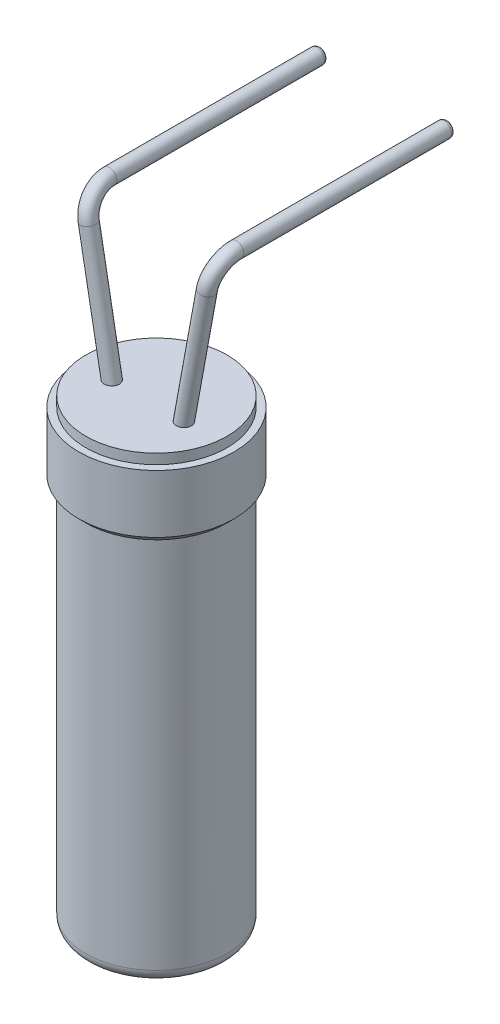
ISO-10303-21;
HEADER;
FILE_DESCRIPTION(('STEP AP214'),'2;1');
FILE_NAME('part.step','',(''),(''),'','','');
FILE_SCHEMA(('AUTOMOTIVE_DESIGN { 1 0 10303 214 1 1 1 1 }'));
ENDSEC;
DATA;
#1=APPLICATION_CONTEXT('core data for automotive mechanical design processes');
#2=APPLICATION_PROTOCOL_DEFINITION('international standard','automotive_design',2000,#1);
#3=PRODUCT_CONTEXT('',#1,'mechanical');
#4=PRODUCT('Part','Part','',(#3));
#5=PRODUCT_RELATED_PRODUCT_CATEGORY('part','',(#4));
#6=PRODUCT_DEFINITION_FORMATION('','',#4);
#7=PRODUCT_DEFINITION_CONTEXT('part definition',#1,'design');
#8=PRODUCT_DEFINITION('design','',#6,#7);
#9=PRODUCT_DEFINITION_SHAPE('','',#8);
#10=(LENGTH_UNIT() NAMED_UNIT(*) SI_UNIT(.MILLI.,.METRE.));
#11=(NAMED_UNIT(*) PLANE_ANGLE_UNIT() SI_UNIT($,.RADIAN.));
#12=(NAMED_UNIT(*) SI_UNIT($,.STERADIAN.) SOLID_ANGLE_UNIT());
#13=UNCERTAINTY_MEASURE_WITH_UNIT(LENGTH_MEASURE(1.E-05),#10,'distance_accuracy_value','');
#14=(GEOMETRIC_REPRESENTATION_CONTEXT(3) GLOBAL_UNCERTAINTY_ASSIGNED_CONTEXT((#13)) GLOBAL_UNIT_ASSIGNED_CONTEXT((#10,
#11,#12)) REPRESENTATION_CONTEXT('',''));
#15=CARTESIAN_POINT('',(0.,0.,0.));
#16=DIRECTION('',(0.,0.,1.));
#17=DIRECTION('',(1.,0.,0.));
#18=AXIS2_PLACEMENT_3D('',#15,#16,#17);
#19=CARTESIAN_POINT('',(1.27,-12.2,1.55));
#20=DIRECTION('',(0.,-1.,0.));
#21=DIRECTION('',(-1.,0.,0.));
#22=AXIS2_PLACEMENT_3D('',#19,#20,#21);
#23=PLANE('',#22);
#24=CARTESIAN_POINT('',(1.27,-12.2,1.55));
#25=DIRECTION('',(0.,-1.,0.));
#26=DIRECTION('',(0.,0.,-1.));
#27=AXIS2_PLACEMENT_3D('',#24,#25,#26);
#28=CIRCLE('',#27,1.159090909091);
#29=CARTESIAN_POINT('',(1.27,-12.2,0.390909090909));
#30=VERTEX_POINT('',#29);
#31=EDGE_CURVE('E10',#30,#30,#28,.T.);
#32=ORIENTED_EDGE('',*,*,#31,.T.);
#33=EDGE_LOOP('',(#32));
#34=FACE_BOUND('',#33,.T.);
#35=ADVANCED_FACE('F15',(#34),#23,.T.);
#36=CARTESIAN_POINT('',(1.27,-11.95,1.55));
#37=DIRECTION('',(0.,-1.,0.));
#38=DIRECTION('',(0.,0.,-1.));
#39=AXIS2_PLACEMENT_3D('',#36,#37,#38);
#40=TOROIDAL_SURFACE('',#39,1.159090909091,0.25);
#41=ORIENTED_EDGE('',*,*,#31,.F.);
#42=EDGE_LOOP('',(#41));
#43=FACE_BOUND('',#42,.T.);
#44=CARTESIAN_POINT('',(1.27,-11.95,1.55));
#45=DIRECTION('',(0.,-1.,0.));
#46=DIRECTION('',(0.,0.,-1.));
#47=AXIS2_PLACEMENT_3D('',#44,#45,#46);
#48=CIRCLE('',#47,1.409090909091);
#49=CARTESIAN_POINT('',(1.27,-11.95,0.140909090909));
#50=VERTEX_POINT('',#49);
#51=EDGE_CURVE('E22',#50,#50,#48,.T.);
#52=ORIENTED_EDGE('',*,*,#51,.T.);
#53=EDGE_LOOP('',(#52));
#54=FACE_BOUND('',#53,.T.);
#55=ADVANCED_FACE('F117',(#43,#54),#40,.T.);
#56=CARTESIAN_POINT('',(2.54,0.,-3.));
#57=DIRECTION('',(0.,0.,1.));
#58=DIRECTION('',(1.,0.,0.));
#59=AXIS2_PLACEMENT_3D('',#56,#57,#58);
#60=PLANE('',#59);
#61=CARTESIAN_POINT('',(2.54,0.,-3.));
#62=DIRECTION('',(0.,0.,1.));
#63=DIRECTION('',(-0.180327868852024,-0.983606557377129,0.));
#64=AXIS2_PLACEMENT_3D('',#61,#62,#63);
#65=CIRCLE('',#64,0.075);
#66=CARTESIAN_POINT('',(2.5264754098361,-0.0737704918032847,-3.));
#67=VERTEX_POINT('',#66);
#68=EDGE_CURVE('E28',#67,#67,#65,.T.);
#69=ORIENTED_EDGE('',*,*,#68,.F.);
#70=EDGE_LOOP('',(#69));
#71=FACE_BOUND('',#70,.T.);
#72=ADVANCED_FACE('F121',(#71),#60,.F.);
#73=CARTESIAN_POINT('',(1.27,-3.2,1.55));
#74=DIRECTION('',(0.,1.,0.));
#75=DIRECTION('',(0.,0.,-1.));
#76=AXIS2_PLACEMENT_3D('',#73,#74,#75);
#77=CYLINDRICAL_SURFACE('',#76,1.409090909091);
#78=ORIENTED_EDGE('',*,*,#51,.F.);
#79=EDGE_LOOP('',(#78));
#80=FACE_BOUND('',#79,.T.);
#81=CARTESIAN_POINT('',(1.27,-4.499659090909,1.55));
#82=DIRECTION('',(0.,1.,0.));
#83=DIRECTION('',(1.,0.,0.));
#84=AXIS2_PLACEMENT_3D('',#81,#82,#83);
#85=CIRCLE('',#84,1.409090909091);
#86=CARTESIAN_POINT('',(2.679090909091,-4.499659090909,1.55));
#87=VERTEX_POINT('',#86);
#88=EDGE_CURVE('E38',#87,#87,#85,.T.);
#89=ORIENTED_EDGE('',*,*,#88,.F.);
#90=EDGE_LOOP('',(#89));
#91=FACE_BOUND('',#90,.T.);
#92=ADVANCED_FACE('F126',(#80,#91),#77,.T.);
#93=CARTESIAN_POINT('',(2.54,0.,-2.925));
#94=DIRECTION('',(0.,0.,-1.));
#95=DIRECTION('',(-0.180327868852024,-0.983606557377129,0.));
#96=AXIS2_PLACEMENT_3D('',#93,#94,#95);
#97=DEGENERATE_TOROIDAL_SURFACE('',#96,0.075,0.075,.T.);
#98=ORIENTED_EDGE('',*,*,#68,.T.);
#99=EDGE_LOOP('',(#98));
#100=FACE_BOUND('',#99,.T.);
#101=CARTESIAN_POINT('',(2.54,0.,-2.925));
#102=DIRECTION('',(0.,0.,1.));
#103=DIRECTION('',(-0.180327868852024,-0.983606557377129,0.));
#104=AXIS2_PLACEMENT_3D('',#101,#102,#103);
#105=CIRCLE('',#104,0.15);
#106=CARTESIAN_POINT('',(2.5129508196722,-0.147540983606569,-2.925));
#107=VERTEX_POINT('',#106);
#108=EDGE_CURVE('E45',#107,#107,#105,.T.);
#109=ORIENTED_EDGE('',*,*,#108,.F.);
#110=EDGE_LOOP('',(#109));
#111=FACE_BOUND('',#110,.T.);
#112=ADVANCED_FACE('F135',(#100,#111),#97,.T.);
#113=CARTESIAN_POINT('',(1.27,-4.35875,1.55));
#114=DIRECTION('',(0.,1.,0.));
#115=DIRECTION('',(0.,0.,-1.));
#116=AXIS2_PLACEMENT_3D('',#113,#114,#115);
#117=CONICAL_SURFACE('',#116,1.55,0.785398163397);
#118=ORIENTED_EDGE('',*,*,#88,.T.);
#119=EDGE_LOOP('',(#118));
#120=FACE_BOUND('',#119,.T.);
#121=CARTESIAN_POINT('',(1.27,-4.35875,1.55));
#122=DIRECTION('',(0.,-1.,0.));
#123=DIRECTION('',(0.,0.,-1.));
#124=AXIS2_PLACEMENT_3D('',#121,#122,#123);
#125=CIRCLE('',#124,1.55);
#126=CARTESIAN_POINT('',(1.27,-4.35875,0.));
#127=VERTEX_POINT('',#126);
#128=EDGE_CURVE('E46',#127,#127,#125,.T.);
#129=ORIENTED_EDGE('',*,*,#128,.T.);
#130=EDGE_LOOP('',(#129));
#131=FACE_BOUND('',#130,.T.);
#132=ADVANCED_FACE('F137',(#120,#131),#117,.T.);
#133=CARTESIAN_POINT('',(2.54,0.,-3.));
#134=DIRECTION('',(0.,0.,1.));
#135=DIRECTION('',(-0.180327868852024,-0.983606557377129,0.));
#136=AXIS2_PLACEMENT_3D('',#133,#134,#135);
#137=CYLINDRICAL_SURFACE('',#136,0.15);
#138=CARTESIAN_POINT('',(2.54,0.,1.222222222222));
#139=DIRECTION('',(0.,0.,1.));
#140=DIRECTION('',(-0.180327868852024,-0.983606557377129,0.));
#141=AXIS2_PLACEMENT_3D('',#138,#139,#140);
#142=CIRCLE('',#141,0.15);
#143=CARTESIAN_POINT('',(2.5670491803277,0.147540983606155,1.222222222222));
#144=VERTEX_POINT('',#143);
#145=EDGE_CURVE('E49',#144,#144,#142,.T.);
#146=ORIENTED_EDGE('',*,*,#145,.F.);
#147=EDGE_LOOP('',(#146));
#148=FACE_BOUND('',#147,.T.);
#149=ORIENTED_EDGE('',*,*,#108,.T.);
#150=EDGE_LOOP('',(#149));
#151=FACE_BOUND('',#150,.T.);
#152=ADVANCED_FACE('F139',(#148,#151),#137,.T.);
#153=CARTESIAN_POINT('',(1.27,-3.2,1.55));
#154=DIRECTION('',(0.,1.,0.));
#155=DIRECTION('',(0.,0.,-1.));
#156=AXIS2_PLACEMENT_3D('',#153,#154,#155);
#157=CYLINDRICAL_SURFACE('',#156,1.55);
#158=ORIENTED_EDGE('',*,*,#128,.F.);
#159=EDGE_LOOP('',(#158));
#160=FACE_BOUND('',#159,.T.);
#161=CARTESIAN_POINT('',(1.27,-3.2,1.55));
#162=DIRECTION('',(0.,-1.,0.));
#163=DIRECTION('',(0.,0.,-1.));
#164=AXIS2_PLACEMENT_3D('',#161,#162,#163);
#165=CIRCLE('',#164,1.55);
#166=CARTESIAN_POINT('',(1.27,-3.2,0.));
#167=VERTEX_POINT('',#166);
#168=EDGE_CURVE('E53',#167,#167,#165,.T.);
#169=ORIENTED_EDGE('',*,*,#168,.T.);
#170=EDGE_LOOP('',(#169));
#171=FACE_BOUND('',#170,.T.);
#172=ADVANCED_FACE('F143',(#160,#171),#157,.T.);
#173=CARTESIAN_POINT('',(2.449836065574,-0.491803278689,1.222222222222));
#174=DIRECTION('',(0.983606557377129,-0.180327868852024,0.));
#175=DIRECTION('',(0.180327868852024,0.983606557377129,0.));
#176=AXIS2_PLACEMENT_3D('',#173,#174,#175);
#177=TOROIDAL_SURFACE('',#176,0.5,0.15);
#178=CARTESIAN_POINT('',(2.449836065574,-0.491803278689,1.722222222222));
#179=DIRECTION('',(0.180327868852024,0.983606557377129,0.));
#180=DIRECTION('',(0.,0.,1.));
#181=AXIS2_PLACEMENT_3D('',#178,#179,#180);
#182=CIRCLE('',#181,0.15);
#183=CARTESIAN_POINT('',(2.449836065574,-0.491803278689,1.872222222222));
#184=VERTEX_POINT('',#183);
#185=EDGE_CURVE('E56',#184,#184,#182,.T.);
#186=CARTESIAN_POINT('',(2.449836065574,-0.491803278689,1.222222222222));
#187=DIRECTION('',(0.983606557377129,-0.180327868852024,0.));
#188=DIRECTION('',(0.180327868852024,0.983606557377129,0.));
#189=AXIS2_PLACEMENT_3D('',#186,#187,#188);
#190=CIRCLE('',#189,0.65);
#191=EDGE_CURVE('',#144,#184,#190,.T.);
#192=ORIENTED_EDGE('',*,*,#145,.T.);
#193=ORIENTED_EDGE('',*,*,#185,.T.);
#194=ORIENTED_EDGE('',*,*,#191,.T.);
#195=ORIENTED_EDGE('',*,*,#191,.F.);
#196=EDGE_LOOP('',(#192,#194,#193,#195));
#197=FACE_BOUND('',#196,.T.);
#198=ADVANCED_FACE('F141',(#197),#177,.T.);
#199=CARTESIAN_POINT('',(1.27,-3.2,1.55));
#200=DIRECTION('',(0.,-1.,0.));
#201=DIRECTION('',(-1.,0.,0.));
#202=AXIS2_PLACEMENT_3D('',#199,#200,#201);
#203=PLANE('',#202);
#204=CARTESIAN_POINT('',(1.27,-3.2,1.55));
#205=DIRECTION('',(0.,1.,0.));
#206=DIRECTION('',(0.,0.,-1.));
#207=AXIS2_PLACEMENT_3D('',#204,#205,#206);
#208=CIRCLE('',#207,1.409090909091);
#209=CARTESIAN_POINT('',(1.27,-3.2,0.140909090909));
#210=VERTEX_POINT('',#209);
#211=EDGE_CURVE('E54',#210,#210,#208,.T.);
#212=ORIENTED_EDGE('',*,*,#211,.F.);
#213=EDGE_LOOP('',(#212));
#214=FACE_BOUND('',#213,.T.);
#215=ORIENTED_EDGE('',*,*,#168,.F.);
#216=EDGE_LOOP('',(#215));
#217=FACE_BOUND('',#216,.T.);
#218=ADVANCED_FACE('F148',(#214,#217),#203,.F.);
#219=CARTESIAN_POINT('',(2.449836065574,-0.491803278689,1.722222222222));
#220=DIRECTION('',(-0.180327868852024,-0.983606557377129,0.));
#221=DIRECTION('',(0.,0.,-1.));
#222=AXIS2_PLACEMENT_3D('',#219,#220,#221);
#223=CYLINDRICAL_SURFACE('',#222,0.15);
#224=CARTESIAN_POINT('',(1.99,-3.,1.722222222222));
#225=DIRECTION('',(0.,-1.,0.));
#226=DIRECTION('',(-1.,0.,0.));
#227=AXIS2_PLACEMENT_3D('',#224,#225,#226);
#228=ELLIPSE('',#227,0.1525,0.15);
#229=CARTESIAN_POINT('',(1.8375,-3.,1.722222222222));
#230=VERTEX_POINT('',#229);
#231=EDGE_CURVE('E58',#230,#230,#228,.T.);
#232=ORIENTED_EDGE('',*,*,#231,.F.);
#233=EDGE_LOOP('',(#232));
#234=FACE_BOUND('',#233,.T.);
#235=ORIENTED_EDGE('',*,*,#185,.F.);
#236=EDGE_LOOP('',(#235));
#237=FACE_BOUND('',#236,.T.);
#238=ADVANCED_FACE('F112',(#234,#237),#223,.T.);
#239=CARTESIAN_POINT('',(1.27,-3.,1.55));
#240=DIRECTION('',(0.,1.,0.));
#241=DIRECTION('',(0.,0.,-1.));
#242=AXIS2_PLACEMENT_3D('',#239,#240,#241);
#243=CYLINDRICAL_SURFACE('',#242,1.409090909091);
#244=ORIENTED_EDGE('',*,*,#211,.T.);
#245=EDGE_LOOP('',(#244));
#246=FACE_BOUND('',#245,.T.);
#247=CARTESIAN_POINT('',(1.27,-3.,1.55));
#248=DIRECTION('',(0.,-1.,0.));
#249=DIRECTION('',(0.,0.,-1.));
#250=AXIS2_PLACEMENT_3D('',#247,#248,#249);
#251=CIRCLE('',#250,1.409090909091);
#252=CARTESIAN_POINT('',(1.27,-3.,0.140909090909));
#253=VERTEX_POINT('',#252);
#254=EDGE_CURVE('E63',#253,#253,#251,.T.);
#255=ORIENTED_EDGE('',*,*,#254,.T.);
#256=EDGE_LOOP('',(#255));
#257=FACE_BOUND('',#256,.T.);
#258=ADVANCED_FACE('F96',(#246,#257),#243,.T.);
#259=CARTESIAN_POINT('',(1.27,-3.,1.55));
#260=DIRECTION('',(0.,-1.,0.));
#261=DIRECTION('',(-1.,0.,0.));
#262=AXIS2_PLACEMENT_3D('',#259,#260,#261);
#263=PLANE('',#262);
#264=ORIENTED_EDGE('',*,*,#231,.T.);
#265=EDGE_LOOP('',(#264));
#266=FACE_BOUND('',#265,.T.);
#267=CARTESIAN_POINT('',(0.55,-3.,1.722222222222));
#268=DIRECTION('',(0.,-1.,0.));
#269=DIRECTION('',(1.,0.,0.));
#270=AXIS2_PLACEMENT_3D('',#267,#268,#269);
#271=ELLIPSE('',#270,0.1525,0.15);
#272=CARTESIAN_POINT('',(0.7025,-3.,1.722222222222));
#273=VERTEX_POINT('',#272);
#274=EDGE_CURVE('E67',#273,#273,#271,.T.);
#275=ORIENTED_EDGE('',*,*,#274,.T.);
#276=EDGE_LOOP('',(#275));
#277=FACE_BOUND('',#276,.T.);
#278=ORIENTED_EDGE('',*,*,#254,.F.);
#279=EDGE_LOOP('',(#278));
#280=FACE_BOUND('',#279,.T.);
#281=ADVANCED_FACE('F98',(#266,#277,#280),#263,.F.);
#282=CARTESIAN_POINT('',(0.09016393442623,-0.491803278689,1.722222222222));
#283=DIRECTION('',(0.180327868852024,-0.983606557377129,0.));
#284=DIRECTION('',(0.,0.,-1.));
#285=AXIS2_PLACEMENT_3D('',#282,#283,#284);
#286=CYLINDRICAL_SURFACE('',#285,0.15);
#287=ORIENTED_EDGE('',*,*,#274,.F.);
#288=EDGE_LOOP('',(#287));
#289=FACE_BOUND('',#288,.T.);
#290=CARTESIAN_POINT('',(0.09016393442623,-0.491803278689,1.722222222222));
#291=DIRECTION('',(-0.180327868852024,0.983606557377129,0.));
#292=DIRECTION('',(0.,0.,1.));
#293=AXIS2_PLACEMENT_3D('',#290,#291,#292);
#294=CIRCLE('',#293,0.15);
#295=CARTESIAN_POINT('',(0.09016393442623,-0.491803278689,1.872222222222));
#296=VERTEX_POINT('',#295);
#297=EDGE_CURVE('E65',#296,#296,#294,.T.);
#298=ORIENTED_EDGE('',*,*,#297,.F.);
#299=EDGE_LOOP('',(#298));
#300=FACE_BOUND('',#299,.T.);
#301=ADVANCED_FACE('F99',(#289,#300),#286,.T.);
#302=CARTESIAN_POINT('',(0.,0.,-3.));
#303=DIRECTION('',(0.,0.,1.));
#304=DIRECTION('',(1.,0.,0.));
#305=AXIS2_PLACEMENT_3D('',#302,#303,#304);
#306=PLANE('',#305);
#307=CARTESIAN_POINT('',(0.,0.,-3.));
#308=DIRECTION('',(0.,0.,1.));
#309=DIRECTION('',(0.180327868852024,-0.983606557377129,0.));
#310=AXIS2_PLACEMENT_3D('',#307,#308,#309);
#311=CIRCLE('',#310,0.075);
#312=CARTESIAN_POINT('',(0.0135245901639018,-0.0737704918032847,-3.));
#313=VERTEX_POINT('',#312);
#314=EDGE_CURVE('E69',#313,#313,#311,.T.);
#315=ORIENTED_EDGE('',*,*,#314,.F.);
#316=EDGE_LOOP('',(#315));
#317=FACE_BOUND('',#316,.T.);
#318=ADVANCED_FACE('F107',(#317),#306,.F.);
#319=CARTESIAN_POINT('',(0.09016393442623,-0.491803278689,1.222222222222));
#320=DIRECTION('',(0.983606557377129,0.180327868852024,0.));
#321=DIRECTION('',(-0.180327868852024,0.983606557377129,0.));
#322=AXIS2_PLACEMENT_3D('',#319,#320,#321);
#323=TOROIDAL_SURFACE('',#322,0.5,0.15);
#324=CARTESIAN_POINT('',(0.,0.,1.222222222222));
#325=DIRECTION('',(0.,0.,1.));
#326=DIRECTION('',(0.180327868852024,-0.983606557377129,0.));
#327=AXIS2_PLACEMENT_3D('',#324,#325,#326);
#328=CIRCLE('',#327,0.15);
#329=CARTESIAN_POINT('',(-0.0270491803277593,0.147540983606102,1.222222222222));
#330=VERTEX_POINT('',#329);
#331=EDGE_CURVE('E87',#330,#330,#328,.T.);
#332=CARTESIAN_POINT('',(0.09016393442623,-0.491803278689,1.222222222222));
#333=DIRECTION('',(0.983606557377129,0.180327868852024,0.));
#334=DIRECTION('',(-0.180327868852024,0.983606557377129,0.));
#335=AXIS2_PLACEMENT_3D('',#332,#333,#334);
#336=CIRCLE('',#335,0.65);
#337=EDGE_CURVE('',#330,#296,#336,.T.);
#338=ORIENTED_EDGE('',*,*,#331,.T.);
#339=ORIENTED_EDGE('',*,*,#297,.T.);
#340=ORIENTED_EDGE('',*,*,#337,.T.);
#341=ORIENTED_EDGE('',*,*,#337,.F.);
#342=EDGE_LOOP('',(#338,#340,#339,#341));
#343=FACE_BOUND('',#342,.T.);
#344=ADVANCED_FACE('F168',(#343),#323,.T.);
#345=CARTESIAN_POINT('',(0.,0.,-2.925));
#346=DIRECTION('',(0.,0.,-1.));
#347=DIRECTION('',(0.180327868852024,-0.983606557377129,0.));
#348=AXIS2_PLACEMENT_3D('',#345,#346,#347);
#349=DEGENERATE_TOROIDAL_SURFACE('',#348,0.075,0.075,.T.);
#350=ORIENTED_EDGE('',*,*,#314,.T.);
#351=EDGE_LOOP('',(#350));
#352=FACE_BOUND('',#351,.T.);
#353=CARTESIAN_POINT('',(0.,0.,-2.925));
#354=DIRECTION('',(0.,0.,1.));
#355=DIRECTION('',(0.180327868852024,-0.983606557377129,0.));
#356=AXIS2_PLACEMENT_3D('',#353,#354,#355);
#357=CIRCLE('',#356,0.15);
#358=CARTESIAN_POINT('',(0.0270491803278035,-0.147540983606569,-2.925));
#359=VERTEX_POINT('',#358);
#360=EDGE_CURVE('E79',#359,#359,#357,.T.);
#361=ORIENTED_EDGE('',*,*,#360,.F.);
#362=EDGE_LOOP('',(#361));
#363=FACE_BOUND('',#362,.T.);
#364=ADVANCED_FACE('F174',(#352,#363),#349,.T.);
#365=CARTESIAN_POINT('',(0.,0.,-3.));
#366=DIRECTION('',(0.,0.,1.));
#367=DIRECTION('',(0.180327868852024,-0.983606557377129,0.));
#368=AXIS2_PLACEMENT_3D('',#365,#366,#367);
#369=CYLINDRICAL_SURFACE('',#368,0.15);
#370=ORIENTED_EDGE('',*,*,#331,.F.);
#371=EDGE_LOOP('',(#370));
#372=FACE_BOUND('',#371,.T.);
#373=ORIENTED_EDGE('',*,*,#360,.T.);
#374=EDGE_LOOP('',(#373));
#375=FACE_BOUND('',#374,.T.);
#376=ADVANCED_FACE('F175',(#372,#375),#369,.T.);
#377=CLOSED_SHELL('',(#35,#55,#72,#92,#112,#132,#152,#172,#198,#218,#238,#258,#281,#301,#318,
#344,#364,#376));
#378=MANIFOLD_SOLID_BREP('B1',#377);
#379=ADVANCED_BREP_SHAPE_REPRESENTATION('',(#18,#378),#14);
#380=SHAPE_DEFINITION_REPRESENTATION(#9,#379);
ENDSEC;
END-ISO-10303-21;
